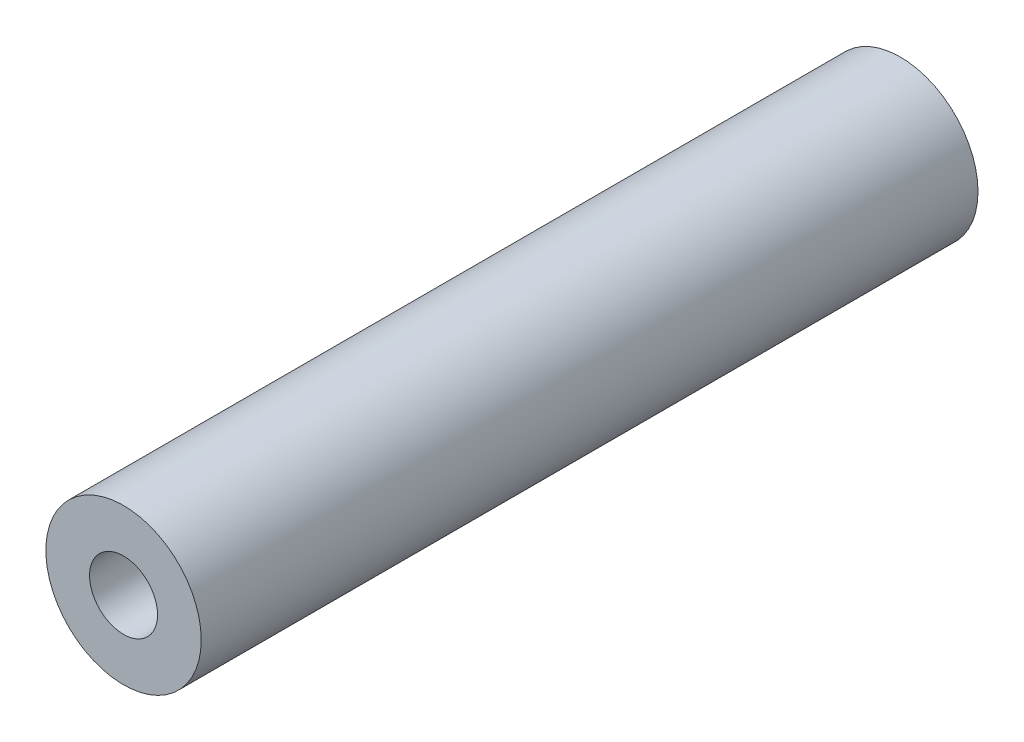
ISO-10303-21;
HEADER;
FILE_DESCRIPTION(('STEP AP214'),'2;1');
FILE_NAME('part.step','',(''),(''),'','','');
FILE_SCHEMA(('AUTOMOTIVE_DESIGN { 1 0 10303 214 1 1 1 1 }'));
ENDSEC;
DATA;
#1=APPLICATION_CONTEXT('core data for automotive mechanical design processes');
#2=APPLICATION_PROTOCOL_DEFINITION('international standard','automotive_design',2000,#1);
#3=PRODUCT_CONTEXT('',#1,'mechanical');
#4=PRODUCT('Part','Part','',(#3));
#5=PRODUCT_RELATED_PRODUCT_CATEGORY('part','',(#4));
#6=PRODUCT_DEFINITION_FORMATION('','',#4);
#7=PRODUCT_DEFINITION_CONTEXT('part definition',#1,'design');
#8=PRODUCT_DEFINITION('design','',#6,#7);
#9=PRODUCT_DEFINITION_SHAPE('','',#8);
#10=(LENGTH_UNIT() NAMED_UNIT(*) SI_UNIT(.MILLI.,.METRE.));
#11=(NAMED_UNIT(*) PLANE_ANGLE_UNIT() SI_UNIT($,.RADIAN.));
#12=(NAMED_UNIT(*) SI_UNIT($,.STERADIAN.) SOLID_ANGLE_UNIT());
#13=UNCERTAINTY_MEASURE_WITH_UNIT(LENGTH_MEASURE(1.E-05),#10,'distance_accuracy_value','');
#14=(GEOMETRIC_REPRESENTATION_CONTEXT(3) GLOBAL_UNCERTAINTY_ASSIGNED_CONTEXT((#13)) GLOBAL_UNIT_ASSIGNED_CONTEXT((#10,
#11,#12)) REPRESENTATION_CONTEXT('',''));
#15=CARTESIAN_POINT('',(0.,0.,0.));
#16=DIRECTION('',(0.,0.,1.));
#17=DIRECTION('',(1.,0.,0.));
#18=AXIS2_PLACEMENT_3D('',#15,#16,#17);
#19=CARTESIAN_POINT('',(0.,0.,40.));
#20=DIRECTION('',(0.,0.,1.));
#21=DIRECTION('',(1.,0.,0.));
#22=AXIS2_PLACEMENT_3D('',#19,#20,#21);
#23=PLANE('',#22);
#24=CARTESIAN_POINT('',(0.,0.,40.));
#25=DIRECTION('',(0.,0.,1.));
#26=DIRECTION('',(1.,0.,0.));
#27=AXIS2_PLACEMENT_3D('',#24,#25,#26);
#28=CIRCLE('',#27,4.);
#29=CARTESIAN_POINT('',(4.,0.,40.));
#30=VERTEX_POINT('',#29);
#31=EDGE_CURVE('E10',#30,#30,#28,.T.);
#32=ORIENTED_EDGE('',*,*,#31,.T.);
#33=EDGE_LOOP('',(#32));
#34=FACE_BOUND('',#33,.T.);
#35=CARTESIAN_POINT('',(0.,0.,40.));
#36=DIRECTION('',(0.,0.,1.));
#37=DIRECTION('',(1.,0.,0.));
#38=AXIS2_PLACEMENT_3D('',#35,#36,#37);
#39=CIRCLE('',#38,1.75);
#40=CARTESIAN_POINT('',(1.75,0.,40.));
#41=VERTEX_POINT('',#40);
#42=EDGE_CURVE('E44',#41,#41,#39,.T.);
#43=ORIENTED_EDGE('',*,*,#42,.F.);
#44=EDGE_LOOP('',(#43));
#45=FACE_BOUND('',#44,.T.);
#46=ADVANCED_FACE('F33',(#34,#45),#23,.T.);
#47=CARTESIAN_POINT('',(0.,0.,0.));
#48=DIRECTION('',(0.,0.,1.));
#49=DIRECTION('',(1.,0.,0.));
#50=AXIS2_PLACEMENT_3D('',#47,#48,#49);
#51=PLANE('',#50);
#52=CARTESIAN_POINT('',(0.,0.,0.));
#53=DIRECTION('',(0.,0.,1.));
#54=DIRECTION('',(1.,0.,0.));
#55=AXIS2_PLACEMENT_3D('',#52,#53,#54);
#56=CIRCLE('',#55,4.);
#57=CARTESIAN_POINT('',(4.,0.,0.));
#58=VERTEX_POINT('',#57);
#59=EDGE_CURVE('E37',#58,#58,#56,.T.);
#60=ORIENTED_EDGE('',*,*,#59,.F.);
#61=EDGE_LOOP('',(#60));
#62=FACE_BOUND('',#61,.T.);
#63=CARTESIAN_POINT('',(0.,0.,0.));
#64=DIRECTION('',(0.,0.,1.));
#65=DIRECTION('',(1.,0.,0.));
#66=AXIS2_PLACEMENT_3D('',#63,#64,#65);
#67=CIRCLE('',#66,1.75);
#68=CARTESIAN_POINT('',(1.75,0.,0.));
#69=VERTEX_POINT('',#68);
#70=EDGE_CURVE('E46',#69,#69,#67,.T.);
#71=ORIENTED_EDGE('',*,*,#70,.T.);
#72=EDGE_LOOP('',(#71));
#73=FACE_BOUND('',#72,.T.);
#74=ADVANCED_FACE('F56',(#62,#73),#51,.F.);
#75=CARTESIAN_POINT('',(0.,0.,40.));
#76=DIRECTION('',(0.,0.,-1.));
#77=DIRECTION('',(-1.,0.,0.));
#78=AXIS2_PLACEMENT_3D('',#75,#76,#77);
#79=CYLINDRICAL_SURFACE('',#78,4.);
#80=ORIENTED_EDGE('',*,*,#31,.F.);
#81=EDGE_LOOP('',(#80));
#82=FACE_BOUND('',#81,.T.);
#83=ORIENTED_EDGE('',*,*,#59,.T.);
#84=EDGE_LOOP('',(#83));
#85=FACE_BOUND('',#84,.T.);
#86=ADVANCED_FACE('F35',(#82,#85),#79,.T.);
#87=CARTESIAN_POINT('',(0.,0.,40.));
#88=DIRECTION('',(0.,0.,-1.));
#89=DIRECTION('',(-1.,0.,0.));
#90=AXIS2_PLACEMENT_3D('',#87,#88,#89);
#91=CYLINDRICAL_SURFACE('',#90,1.75);
#92=ORIENTED_EDGE('',*,*,#42,.T.);
#93=EDGE_LOOP('',(#92));
#94=FACE_BOUND('',#93,.T.);
#95=ORIENTED_EDGE('',*,*,#70,.F.);
#96=EDGE_LOOP('',(#95));
#97=FACE_BOUND('',#96,.T.);
#98=ADVANCED_FACE('F52',(#94,#97),#91,.F.);
#99=CLOSED_SHELL('',(#46,#74,#86,#98));
#100=MANIFOLD_SOLID_BREP('B2',#99);
#101=ADVANCED_BREP_SHAPE_REPRESENTATION('',(#18,#100),#14);
#102=SHAPE_DEFINITION_REPRESENTATION(#9,#101);
ENDSEC;
END-ISO-10303-21;
